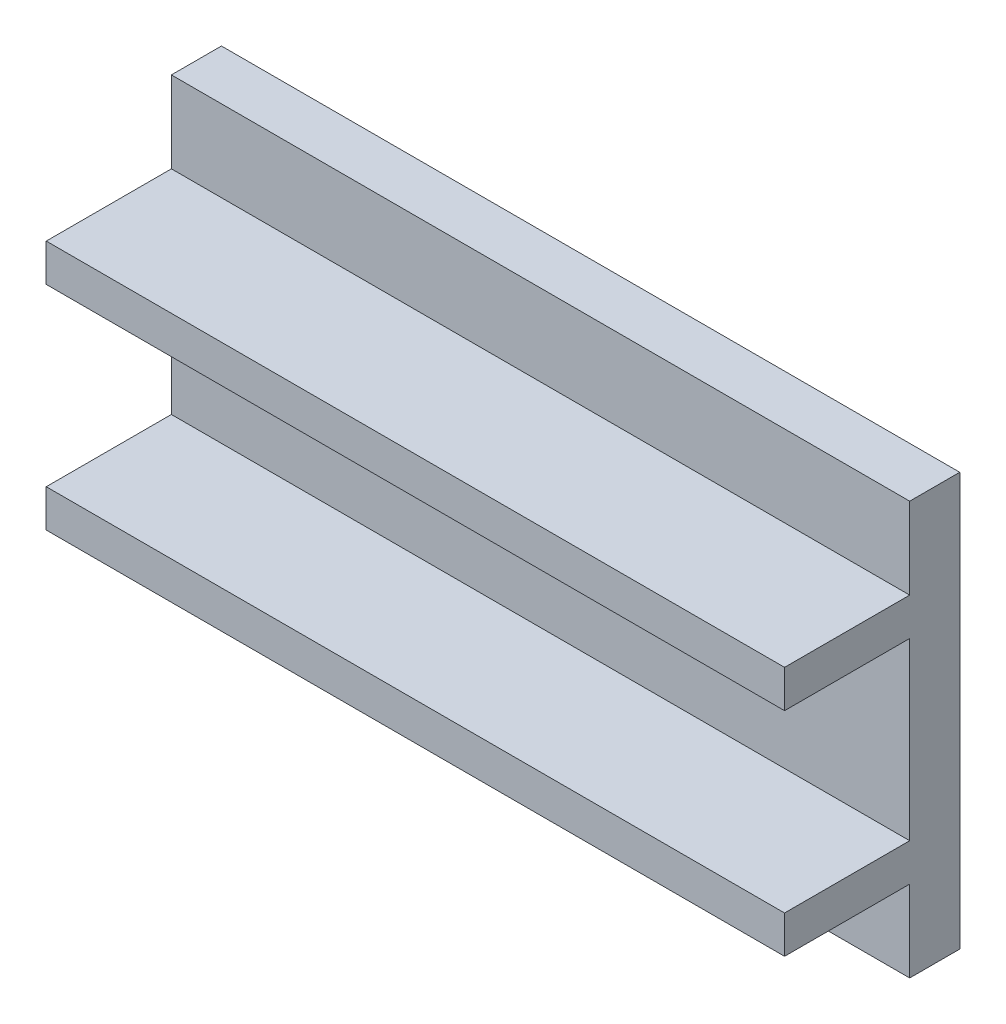
ISO-10303-21;
HEADER;
FILE_DESCRIPTION(('STEP AP214'),'2;1');
FILE_NAME('part.step','',(''),(''),'','','');
FILE_SCHEMA(('AUTOMOTIVE_DESIGN { 1 0 10303 214 1 1 1 1 }'));
ENDSEC;
DATA;
#1=APPLICATION_CONTEXT('core data for automotive mechanical design processes');
#2=APPLICATION_PROTOCOL_DEFINITION('international standard','automotive_design',2000,#1);
#3=PRODUCT_CONTEXT('',#1,'mechanical');
#4=PRODUCT('Part','Part','',(#3));
#5=PRODUCT_RELATED_PRODUCT_CATEGORY('part','',(#4));
#6=PRODUCT_DEFINITION_FORMATION('','',#4);
#7=PRODUCT_DEFINITION_CONTEXT('part definition',#1,'design');
#8=PRODUCT_DEFINITION('design','',#6,#7);
#9=PRODUCT_DEFINITION_SHAPE('','',#8);
#10=(LENGTH_UNIT() NAMED_UNIT(*) SI_UNIT(.MILLI.,.METRE.));
#11=(NAMED_UNIT(*) PLANE_ANGLE_UNIT() SI_UNIT($,.RADIAN.));
#12=(NAMED_UNIT(*) SI_UNIT($,.STERADIAN.) SOLID_ANGLE_UNIT());
#13=UNCERTAINTY_MEASURE_WITH_UNIT(LENGTH_MEASURE(1.E-05),#10,'distance_accuracy_value','');
#14=(GEOMETRIC_REPRESENTATION_CONTEXT(3) GLOBAL_UNCERTAINTY_ASSIGNED_CONTEXT((#13)) GLOBAL_UNIT_ASSIGNED_CONTEXT((#10,
#11,#12)) REPRESENTATION_CONTEXT('',''));
#15=CARTESIAN_POINT('',(0.,0.,0.));
#16=DIRECTION('',(0.,0.,1.));
#17=DIRECTION('',(1.,0.,0.));
#18=AXIS2_PLACEMENT_3D('',#15,#16,#17);
#19=CARTESIAN_POINT('',(0.,0.,2.));
#20=DIRECTION('',(0.,0.,1.));
#21=DIRECTION('',(1.,0.,0.));
#22=AXIS2_PLACEMENT_3D('',#19,#20,#21);
#23=PLANE('',#22);
#24=DIRECTION('',(0.,-1.,0.));
#25=VECTOR('',#24,1.);
#26=CARTESIAN_POINT('',(-14.75,8.25000000000001,2.));
#27=LINE('',#26,#25);
#28=CARTESIAN_POINT('',(-14.75,3.5,2.));
#29=VERTEX_POINT('',#28);
#30=CARTESIAN_POINT('',(-14.75,-3.5,2.));
#31=VERTEX_POINT('',#30);
#32=EDGE_CURVE('E231',#29,#31,#27,.T.);
#33=ORIENTED_EDGE('',*,*,#32,.T.);
#34=DIRECTION('',(-1.,0.,0.));
#35=VECTOR('',#34,1.);
#36=CARTESIAN_POINT('',(0.,-3.5,2.));
#37=LINE('',#36,#35);
#38=CARTESIAN_POINT('',(14.75,-3.5,2.));
#39=VERTEX_POINT('',#38);
#40=EDGE_CURVE('E61',#39,#31,#37,.T.);
#41=ORIENTED_EDGE('',*,*,#40,.F.);
#42=DIRECTION('',(0.,1.,0.));
#43=VECTOR('',#42,1.);
#44=CARTESIAN_POINT('',(14.75,8.25000000000001,2.));
#45=LINE('',#44,#43);
#46=CARTESIAN_POINT('',(14.75,3.5,2.));
#47=VERTEX_POINT('',#46);
#48=EDGE_CURVE('E222',#39,#47,#45,.T.);
#49=ORIENTED_EDGE('',*,*,#48,.T.);
#50=DIRECTION('',(-1.,0.,0.));
#51=VECTOR('',#50,1.);
#52=CARTESIAN_POINT('',(0.,3.5,2.));
#53=LINE('',#52,#51);
#54=EDGE_CURVE('E188',#47,#29,#53,.T.);
#55=ORIENTED_EDGE('',*,*,#54,.T.);
#56=EDGE_LOOP('',(#33,#41,#49,#55));
#57=FACE_BOUND('',#56,.T.);
#58=ADVANCED_FACE('F45',(#57),#23,.T.);
#59=DIRECTION('',(-1.,0.,0.));
#60=VECTOR('',#59,1.);
#61=CARTESIAN_POINT('',(0.,-5.,2.));
#62=LINE('',#61,#60);
#63=CARTESIAN_POINT('',(14.75,-5.,2.));
#64=VERTEX_POINT('',#63);
#65=CARTESIAN_POINT('',(-14.75,-5.,2.));
#66=VERTEX_POINT('',#65);
#67=EDGE_CURVE('E142',#64,#66,#62,.T.);
#68=ORIENTED_EDGE('',*,*,#67,.T.);
#69=CARTESIAN_POINT('',(-14.75,-8.24999999999999,2.));
#70=VERTEX_POINT('',#69);
#71=EDGE_CURVE('E226',#66,#70,#27,.T.);
#72=ORIENTED_EDGE('',*,*,#71,.T.);
#73=DIRECTION('',(1.,0.,0.));
#74=VECTOR('',#73,1.);
#75=CARTESIAN_POINT('',(-14.75,-8.24999999999999,2.));
#76=LINE('',#75,#74);
#77=CARTESIAN_POINT('',(14.75,-8.24999999999999,2.));
#78=VERTEX_POINT('',#77);
#79=EDGE_CURVE('E230',#70,#78,#76,.T.);
#80=ORIENTED_EDGE('',*,*,#79,.T.);
#81=EDGE_CURVE('E69',#78,#64,#45,.T.);
#82=ORIENTED_EDGE('',*,*,#81,.T.);
#83=EDGE_LOOP('',(#68,#72,#80,#82));
#84=FACE_BOUND('',#83,.T.);
#85=ADVANCED_FACE('F288',(#84),#23,.T.);
#86=CARTESIAN_POINT('',(14.75,8.25000000000001,2.));
#87=DIRECTION('',(-1.,0.,0.));
#88=DIRECTION('',(0.,-1.,0.));
#89=AXIS2_PLACEMENT_3D('',#86,#87,#88);
#90=PLANE('',#89);
#91=DIRECTION('',(0.,1.,0.));
#92=VECTOR('',#91,1.);
#93=CARTESIAN_POINT('',(14.75,8.25000000000001,0.));
#94=LINE('',#93,#92);
#95=CARTESIAN_POINT('',(14.75,-8.24999999999999,0.));
#96=VERTEX_POINT('',#95);
#97=CARTESIAN_POINT('',(14.75,8.25000000000001,0.));
#98=VERTEX_POINT('',#97);
#99=EDGE_CURVE('E218',#96,#98,#94,.T.);
#100=ORIENTED_EDGE('',*,*,#99,.T.);
#101=DIRECTION('',(0.,0.,-1.));
#102=VECTOR('',#101,1.);
#103=CARTESIAN_POINT('',(14.75,8.25000000000001,2.));
#104=LINE('',#103,#102);
#105=CARTESIAN_POINT('',(14.75,8.25000000000001,2.));
#106=VERTEX_POINT('',#105);
#107=EDGE_CURVE('E11',#106,#98,#104,.T.);
#108=ORIENTED_EDGE('',*,*,#107,.F.);
#109=CARTESIAN_POINT('',(14.75,5.,2.));
#110=VERTEX_POINT('',#109);
#111=EDGE_CURVE('E223',#110,#106,#45,.T.);
#112=ORIENTED_EDGE('',*,*,#111,.F.);
#113=DIRECTION('',(0.,0.,-1.));
#114=VECTOR('',#113,1.);
#115=CARTESIAN_POINT('',(14.75,5.,7.));
#116=LINE('',#115,#114);
#117=CARTESIAN_POINT('',(14.75,5.,7.));
#118=VERTEX_POINT('',#117);
#119=EDGE_CURVE('E214',#118,#110,#116,.T.);
#120=ORIENTED_EDGE('',*,*,#119,.F.);
#121=DIRECTION('',(0.,1.,0.));
#122=VECTOR('',#121,1.);
#123=CARTESIAN_POINT('',(14.75,0.,7.));
#124=LINE('',#123,#122);
#125=CARTESIAN_POINT('',(14.75,3.5,7.));
#126=VERTEX_POINT('',#125);
#127=EDGE_CURVE('E183',#126,#118,#124,.T.);
#128=ORIENTED_EDGE('',*,*,#127,.F.);
#129=DIRECTION('',(0.,0.,-1.));
#130=VECTOR('',#129,1.);
#131=CARTESIAN_POINT('',(14.75,3.5,7.));
#132=LINE('',#131,#130);
#133=EDGE_CURVE('E198',#126,#47,#132,.T.);
#134=ORIENTED_EDGE('',*,*,#133,.T.);
#135=ORIENTED_EDGE('',*,*,#48,.F.);
#136=DIRECTION('',(0.,0.,-1.));
#137=VECTOR('',#136,1.);
#138=CARTESIAN_POINT('',(14.75,-3.5,7.));
#139=LINE('',#138,#137);
#140=CARTESIAN_POINT('',(14.75,-3.5,7.));
#141=VERTEX_POINT('',#140);
#142=EDGE_CURVE('E146',#141,#39,#139,.T.);
#143=ORIENTED_EDGE('',*,*,#142,.F.);
#144=DIRECTION('',(0.,1.,0.));
#145=VECTOR('',#144,1.);
#146=CARTESIAN_POINT('',(14.75,0.,7.));
#147=LINE('',#146,#145);
#148=CARTESIAN_POINT('',(14.75,-5.,7.));
#149=VERTEX_POINT('',#148);
#150=EDGE_CURVE('E149',#149,#141,#147,.T.);
#151=ORIENTED_EDGE('',*,*,#150,.F.);
#152=DIRECTION('',(0.,0.,-1.));
#153=VECTOR('',#152,1.);
#154=CARTESIAN_POINT('',(14.75,-5.,7.));
#155=LINE('',#154,#153);
#156=EDGE_CURVE('E136',#149,#64,#155,.T.);
#157=ORIENTED_EDGE('',*,*,#156,.T.);
#158=ORIENTED_EDGE('',*,*,#81,.F.);
#159=DIRECTION('',(0.,0.,-1.));
#160=VECTOR('',#159,1.);
#161=CARTESIAN_POINT('',(14.75,-8.24999999999999,2.));
#162=LINE('',#161,#160);
#163=EDGE_CURVE('E234',#78,#96,#162,.T.);
#164=ORIENTED_EDGE('',*,*,#163,.T.);
#165=EDGE_LOOP('',(#100,#108,#112,#120,#128,#134,#135,#143,#151,#157,#158,#164));
#166=FACE_BOUND('',#165,.T.);
#167=ADVANCED_FACE('F47',(#166),#90,.F.);
#168=CARTESIAN_POINT('',(-14.75,8.25000000000001,2.));
#169=DIRECTION('',(0.,-1.,0.));
#170=DIRECTION('',(0.,0.,-1.));
#171=AXIS2_PLACEMENT_3D('',#168,#169,#170);
#172=PLANE('',#171);
#173=DIRECTION('',(-1.,0.,0.));
#174=VECTOR('',#173,1.);
#175=CARTESIAN_POINT('',(-14.75,8.25000000000001,0.));
#176=LINE('',#175,#174);
#177=CARTESIAN_POINT('',(-14.75,8.25000000000001,0.));
#178=VERTEX_POINT('',#177);
#179=EDGE_CURVE('E237',#98,#178,#176,.T.);
#180=ORIENTED_EDGE('',*,*,#179,.T.);
#181=DIRECTION('',(0.,0.,-1.));
#182=VECTOR('',#181,1.);
#183=CARTESIAN_POINT('',(-14.75,8.25000000000001,2.));
#184=LINE('',#183,#182);
#185=CARTESIAN_POINT('',(-14.75,8.25000000000001,2.));
#186=VERTEX_POINT('',#185);
#187=EDGE_CURVE('E54',#186,#178,#184,.T.);
#188=ORIENTED_EDGE('',*,*,#187,.F.);
#189=DIRECTION('',(-1.,0.,0.));
#190=VECTOR('',#189,1.);
#191=CARTESIAN_POINT('',(-14.75,8.25000000000001,2.));
#192=LINE('',#191,#190);
#193=EDGE_CURVE('E221',#106,#186,#192,.T.);
#194=ORIENTED_EDGE('',*,*,#193,.F.);
#195=ORIENTED_EDGE('',*,*,#107,.T.);
#196=EDGE_LOOP('',(#180,#188,#194,#195));
#197=FACE_BOUND('',#196,.T.);
#198=ADVANCED_FACE('F273',(#197),#172,.F.);
#199=CARTESIAN_POINT('',(-14.75,8.25000000000001,2.));
#200=DIRECTION('',(1.,0.,0.));
#201=DIRECTION('',(0.,1.,0.));
#202=AXIS2_PLACEMENT_3D('',#199,#200,#201);
#203=PLANE('',#202);
#204=DIRECTION('',(0.,-1.,0.));
#205=VECTOR('',#204,1.);
#206=CARTESIAN_POINT('',(-14.75,8.25000000000001,0.));
#207=LINE('',#206,#205);
#208=CARTESIAN_POINT('',(-14.75,-8.24999999999999,0.));
#209=VERTEX_POINT('',#208);
#210=EDGE_CURVE('E240',#178,#209,#207,.T.);
#211=ORIENTED_EDGE('',*,*,#210,.T.);
#212=DIRECTION('',(0.,0.,-1.));
#213=VECTOR('',#212,1.);
#214=CARTESIAN_POINT('',(-14.75,-8.24999999999999,2.));
#215=LINE('',#214,#213);
#216=EDGE_CURVE('E249',#70,#209,#215,.T.);
#217=ORIENTED_EDGE('',*,*,#216,.F.);
#218=ORIENTED_EDGE('',*,*,#71,.F.);
#219=DIRECTION('',(0.,0.,-1.));
#220=VECTOR('',#219,1.);
#221=CARTESIAN_POINT('',(-14.75,-5.,7.));
#222=LINE('',#221,#220);
#223=CARTESIAN_POINT('',(-14.75,-5.,7.));
#224=VERTEX_POINT('',#223);
#225=EDGE_CURVE('E172',#224,#66,#222,.T.);
#226=ORIENTED_EDGE('',*,*,#225,.F.);
#227=DIRECTION('',(0.,-1.,0.));
#228=VECTOR('',#227,1.);
#229=CARTESIAN_POINT('',(-14.75,0.,7.));
#230=LINE('',#229,#228);
#231=CARTESIAN_POINT('',(-14.75,-3.5,7.));
#232=VERTEX_POINT('',#231);
#233=EDGE_CURVE('E159',#232,#224,#230,.T.);
#234=ORIENTED_EDGE('',*,*,#233,.F.);
#235=DIRECTION('',(0.,0.,-1.));
#236=VECTOR('',#235,1.);
#237=CARTESIAN_POINT('',(-14.75,-3.5,7.));
#238=LINE('',#237,#236);
#239=EDGE_CURVE('E177',#232,#31,#238,.T.);
#240=ORIENTED_EDGE('',*,*,#239,.T.);
#241=ORIENTED_EDGE('',*,*,#32,.F.);
#242=DIRECTION('',(0.,0.,-1.));
#243=VECTOR('',#242,1.);
#244=CARTESIAN_POINT('',(-14.75,3.5,7.));
#245=LINE('',#244,#243);
#246=CARTESIAN_POINT('',(-14.75,3.5,7.));
#247=VERTEX_POINT('',#246);
#248=EDGE_CURVE('E207',#247,#29,#245,.T.);
#249=ORIENTED_EDGE('',*,*,#248,.F.);
#250=DIRECTION('',(0.,-1.,0.));
#251=VECTOR('',#250,1.);
#252=CARTESIAN_POINT('',(-14.75,0.,7.));
#253=LINE('',#252,#251);
#254=CARTESIAN_POINT('',(-14.75,5.,7.));
#255=VERTEX_POINT('',#254);
#256=EDGE_CURVE('E191',#255,#247,#253,.T.);
#257=ORIENTED_EDGE('',*,*,#256,.F.);
#258=DIRECTION('',(0.,0.,-1.));
#259=VECTOR('',#258,1.);
#260=CARTESIAN_POINT('',(-14.75,5.,7.));
#261=LINE('',#260,#259);
#262=CARTESIAN_POINT('',(-14.75,5.,2.));
#263=VERTEX_POINT('',#262);
#264=EDGE_CURVE('E210',#255,#263,#261,.T.);
#265=ORIENTED_EDGE('',*,*,#264,.T.);
#266=EDGE_CURVE('E227',#186,#263,#27,.T.);
#267=ORIENTED_EDGE('',*,*,#266,.F.);
#268=ORIENTED_EDGE('',*,*,#187,.T.);
#269=EDGE_LOOP('',(#211,#217,#218,#226,#234,#240,#241,#249,#257,#265,#267,#268));
#270=FACE_BOUND('',#269,.T.);
#271=ADVANCED_FACE('F258',(#270),#203,.F.);
#272=CARTESIAN_POINT('',(-14.75,-8.24999999999999,2.));
#273=DIRECTION('',(0.,1.,0.));
#274=DIRECTION('',(0.,0.,1.));
#275=AXIS2_PLACEMENT_3D('',#272,#273,#274);
#276=PLANE('',#275);
#277=DIRECTION('',(1.,0.,0.));
#278=VECTOR('',#277,1.);
#279=CARTESIAN_POINT('',(-14.75,-8.24999999999999,0.));
#280=LINE('',#279,#278);
#281=EDGE_CURVE('E243',#209,#96,#280,.T.);
#282=ORIENTED_EDGE('',*,*,#281,.T.);
#283=ORIENTED_EDGE('',*,*,#163,.F.);
#284=ORIENTED_EDGE('',*,*,#79,.F.);
#285=ORIENTED_EDGE('',*,*,#216,.T.);
#286=EDGE_LOOP('',(#282,#283,#284,#285));
#287=FACE_BOUND('',#286,.T.);
#288=ADVANCED_FACE('F268',(#287),#276,.F.);
#289=DIRECTION('',(-1.,0.,0.));
#290=VECTOR('',#289,1.);
#291=CARTESIAN_POINT('',(0.,5.,2.));
#292=LINE('',#291,#290);
#293=EDGE_CURVE('E145',#110,#263,#292,.T.);
#294=ORIENTED_EDGE('',*,*,#293,.F.);
#295=ORIENTED_EDGE('',*,*,#111,.T.);
#296=ORIENTED_EDGE('',*,*,#193,.T.);
#297=ORIENTED_EDGE('',*,*,#266,.T.);
#298=EDGE_LOOP('',(#294,#295,#296,#297));
#299=FACE_BOUND('',#298,.T.);
#300=ADVANCED_FACE('F275',(#299),#23,.T.);
#301=CARTESIAN_POINT('',(0.,0.,0.));
#302=DIRECTION('',(0.,0.,1.));
#303=DIRECTION('',(1.,0.,0.));
#304=AXIS2_PLACEMENT_3D('',#301,#302,#303);
#305=PLANE('',#304);
#306=ORIENTED_EDGE('',*,*,#99,.F.);
#307=ORIENTED_EDGE('',*,*,#281,.F.);
#308=ORIENTED_EDGE('',*,*,#210,.F.);
#309=ORIENTED_EDGE('',*,*,#179,.F.);
#310=EDGE_LOOP('',(#306,#307,#308,#309));
#311=FACE_BOUND('',#310,.T.);
#312=ADVANCED_FACE('F265',(#311),#305,.F.);
#313=CARTESIAN_POINT('',(0.,5.,7.));
#314=DIRECTION('',(0.,-1.,0.));
#315=DIRECTION('',(0.,0.,-1.));
#316=AXIS2_PLACEMENT_3D('',#313,#314,#315);
#317=PLANE('',#316);
#318=ORIENTED_EDGE('',*,*,#293,.T.);
#319=ORIENTED_EDGE('',*,*,#264,.F.);
#320=DIRECTION('',(-1.,0.,0.));
#321=VECTOR('',#320,1.);
#322=CARTESIAN_POINT('',(0.,5.,7.));
#323=LINE('',#322,#321);
#324=EDGE_CURVE('E187',#118,#255,#323,.T.);
#325=ORIENTED_EDGE('',*,*,#324,.F.);
#326=ORIENTED_EDGE('',*,*,#119,.T.);
#327=EDGE_LOOP('',(#318,#319,#325,#326));
#328=FACE_BOUND('',#327,.T.);
#329=ADVANCED_FACE('F300',(#328),#317,.F.);
#330=CARTESIAN_POINT('',(0.,3.5,7.));
#331=DIRECTION('',(0.,-1.,0.));
#332=DIRECTION('',(0.,0.,-1.));
#333=AXIS2_PLACEMENT_3D('',#330,#331,#332);
#334=PLANE('',#333);
#335=ORIENTED_EDGE('',*,*,#54,.F.);
#336=ORIENTED_EDGE('',*,*,#133,.F.);
#337=DIRECTION('',(-1.,0.,0.));
#338=VECTOR('',#337,1.);
#339=CARTESIAN_POINT('',(0.,3.5,7.));
#340=LINE('',#339,#338);
#341=EDGE_CURVE('E194',#126,#247,#340,.T.);
#342=ORIENTED_EDGE('',*,*,#341,.T.);
#343=ORIENTED_EDGE('',*,*,#248,.T.);
#344=EDGE_LOOP('',(#335,#336,#342,#343));
#345=FACE_BOUND('',#344,.T.);
#346=ADVANCED_FACE('F283',(#345),#334,.T.);
#347=CARTESIAN_POINT('',(0.,0.,7.));
#348=DIRECTION('',(0.,0.,1.));
#349=DIRECTION('',(1.,0.,0.));
#350=AXIS2_PLACEMENT_3D('',#347,#348,#349);
#351=PLANE('',#350);
#352=ORIENTED_EDGE('',*,*,#127,.T.);
#353=ORIENTED_EDGE('',*,*,#324,.T.);
#354=ORIENTED_EDGE('',*,*,#256,.T.);
#355=ORIENTED_EDGE('',*,*,#341,.F.);
#356=EDGE_LOOP('',(#352,#353,#354,#355));
#357=FACE_BOUND('',#356,.T.);
#358=ADVANCED_FACE('F338',(#357),#351,.T.);
#359=CARTESIAN_POINT('',(0.,-5.,7.));
#360=DIRECTION('',(0.,-1.,0.));
#361=DIRECTION('',(0.,0.,-1.));
#362=AXIS2_PLACEMENT_3D('',#359,#360,#361);
#363=PLANE('',#362);
#364=ORIENTED_EDGE('',*,*,#67,.F.);
#365=ORIENTED_EDGE('',*,*,#156,.F.);
#366=DIRECTION('',(-1.,0.,0.));
#367=VECTOR('',#366,1.);
#368=CARTESIAN_POINT('',(0.,-5.,7.));
#369=LINE('',#368,#367);
#370=EDGE_CURVE('E141',#149,#224,#369,.T.);
#371=ORIENTED_EDGE('',*,*,#370,.T.);
#372=ORIENTED_EDGE('',*,*,#225,.T.);
#373=EDGE_LOOP('',(#364,#365,#371,#372));
#374=FACE_BOUND('',#373,.T.);
#375=ADVANCED_FACE('F138',(#374),#363,.T.);
#376=CARTESIAN_POINT('',(0.,-3.5,7.));
#377=DIRECTION('',(0.,-1.,0.));
#378=DIRECTION('',(0.,0.,-1.));
#379=AXIS2_PLACEMENT_3D('',#376,#377,#378);
#380=PLANE('',#379);
#381=ORIENTED_EDGE('',*,*,#40,.T.);
#382=ORIENTED_EDGE('',*,*,#239,.F.);
#383=DIRECTION('',(-1.,0.,0.));
#384=VECTOR('',#383,1.);
#385=CARTESIAN_POINT('',(0.,-3.5,7.));
#386=LINE('',#385,#384);
#387=EDGE_CURVE('E155',#141,#232,#386,.T.);
#388=ORIENTED_EDGE('',*,*,#387,.F.);
#389=ORIENTED_EDGE('',*,*,#142,.T.);
#390=EDGE_LOOP('',(#381,#382,#388,#389));
#391=FACE_BOUND('',#390,.T.);
#392=ADVANCED_FACE('F356',(#391),#380,.F.);
#393=CARTESIAN_POINT('',(0.,0.,7.));
#394=DIRECTION('',(0.,0.,1.));
#395=DIRECTION('',(1.,0.,0.));
#396=AXIS2_PLACEMENT_3D('',#393,#394,#395);
#397=PLANE('',#396);
#398=ORIENTED_EDGE('',*,*,#370,.F.);
#399=ORIENTED_EDGE('',*,*,#150,.T.);
#400=ORIENTED_EDGE('',*,*,#387,.T.);
#401=ORIENTED_EDGE('',*,*,#233,.T.);
#402=EDGE_LOOP('',(#398,#399,#400,#401));
#403=FACE_BOUND('',#402,.T.);
#404=ADVANCED_FACE('F157',(#403),#397,.T.);
#405=CLOSED_SHELL('',(#58,#85,#167,#198,#271,#288,#300,#312,#329,#346,#358,#375,#392,#404));
#406=MANIFOLD_SOLID_BREP('B2',#405);
#407=ADVANCED_BREP_SHAPE_REPRESENTATION('',(#18,#406),#14);
#408=SHAPE_DEFINITION_REPRESENTATION(#9,#407);
ENDSEC;
END-ISO-10303-21;
